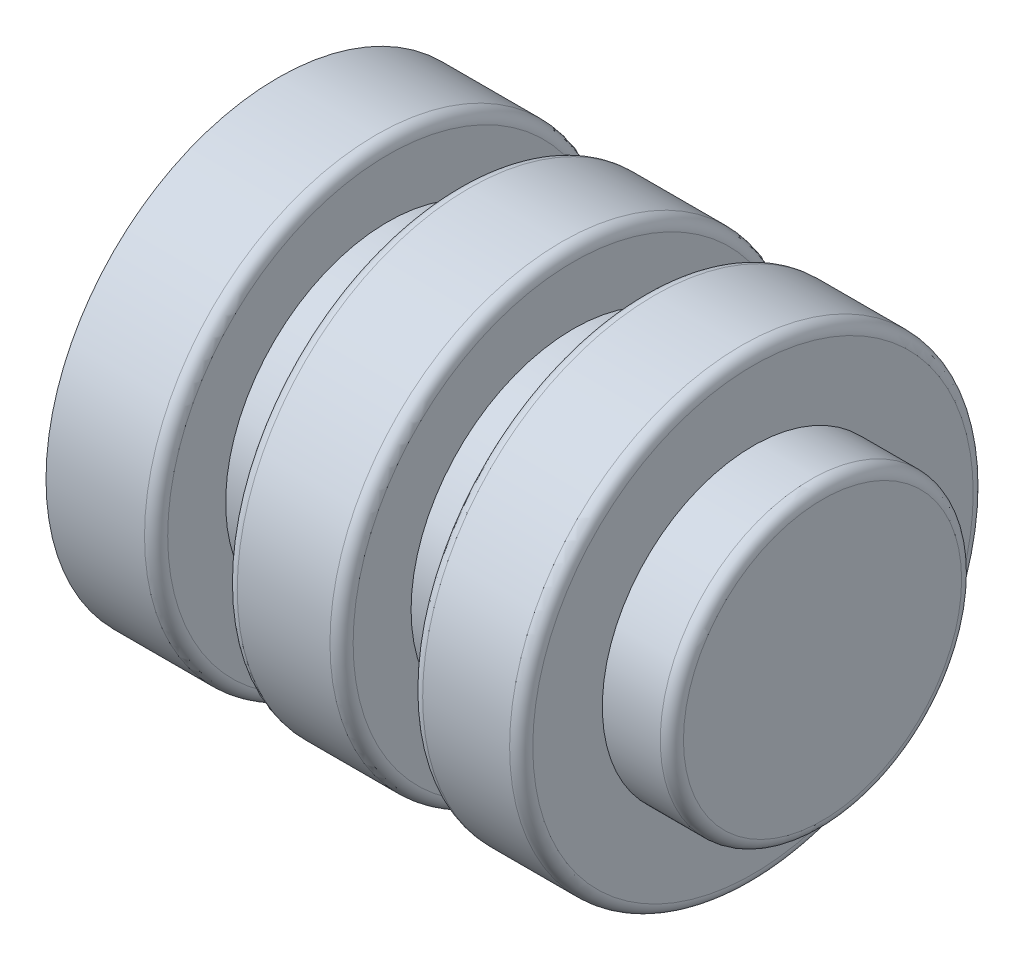
ISO-10303-21;
HEADER;
FILE_DESCRIPTION(('STEP AP214'),'2;1');
FILE_NAME('part.step','',(''),(''),'','','');
FILE_SCHEMA(('AUTOMOTIVE_DESIGN { 1 0 10303 214 1 1 1 1 }'));
ENDSEC;
DATA;
#1=APPLICATION_CONTEXT('core data for automotive mechanical design processes');
#2=APPLICATION_PROTOCOL_DEFINITION('international standard','automotive_design',2000,#1);
#3=PRODUCT_CONTEXT('',#1,'mechanical');
#4=PRODUCT('Part','Part','',(#3));
#5=PRODUCT_RELATED_PRODUCT_CATEGORY('part','',(#4));
#6=PRODUCT_DEFINITION_FORMATION('','',#4);
#7=PRODUCT_DEFINITION_CONTEXT('part definition',#1,'design');
#8=PRODUCT_DEFINITION('design','',#6,#7);
#9=PRODUCT_DEFINITION_SHAPE('','',#8);
#10=(LENGTH_UNIT() NAMED_UNIT(*) SI_UNIT(.MILLI.,.METRE.));
#11=(NAMED_UNIT(*) PLANE_ANGLE_UNIT() SI_UNIT($,.RADIAN.));
#12=(NAMED_UNIT(*) SI_UNIT($,.STERADIAN.) SOLID_ANGLE_UNIT());
#13=UNCERTAINTY_MEASURE_WITH_UNIT(LENGTH_MEASURE(1.E-05),#10,'distance_accuracy_value','');
#14=(GEOMETRIC_REPRESENTATION_CONTEXT(3) GLOBAL_UNCERTAINTY_ASSIGNED_CONTEXT((#13)) GLOBAL_UNIT_ASSIGNED_CONTEXT((#10,
#11,#12)) REPRESENTATION_CONTEXT('',''));
#15=CARTESIAN_POINT('',(0.,0.,0.));
#16=DIRECTION('',(0.,0.,1.));
#17=DIRECTION('',(1.,0.,0.));
#18=AXIS2_PLACEMENT_3D('',#15,#16,#17);
#19=CARTESIAN_POINT('',(-8.,0.,0.));
#20=DIRECTION('',(-1.,0.,0.));
#21=DIRECTION('',(0.,0.,1.));
#22=AXIS2_PLACEMENT_3D('',#19,#20,#21);
#23=PLANE('',#22);
#24=CARTESIAN_POINT('',(-8.,0.,0.));
#25=DIRECTION('',(-1.,0.,0.));
#26=DIRECTION('',(0.,0.,1.));
#27=AXIS2_PLACEMENT_3D('',#24,#25,#26);
#28=CIRCLE('',#27,9.5);
#29=CARTESIAN_POINT('',(-8.,0.,9.5));
#30=VERTEX_POINT('',#29);
#31=EDGE_CURVE('E60',#30,#30,#28,.T.);
#32=ORIENTED_EDGE('',*,*,#31,.T.);
#33=EDGE_LOOP('',(#32));
#34=FACE_BOUND('',#33,.T.);
#35=CARTESIAN_POINT('',(-8.,0.,0.));
#36=DIRECTION('',(-1.,0.,0.));
#37=DIRECTION('',(0.,0.,1.));
#38=AXIS2_PLACEMENT_3D('',#35,#36,#37);
#39=CIRCLE('',#38,7.);
#40=CARTESIAN_POINT('',(-8.,0.,-7.));
#41=VERTEX_POINT('',#40);
#42=EDGE_CURVE('E85',#41,#41,#39,.T.);
#43=ORIENTED_EDGE('',*,*,#42,.F.);
#44=EDGE_LOOP('',(#43));
#45=FACE_BOUND('',#44,.T.);
#46=ADVANCED_FACE('F31',(#34,#45),#23,.T.);
#47=CARTESIAN_POINT('',(0.,0.,0.));
#48=DIRECTION('',(1.,0.,0.));
#49=DIRECTION('',(0.,0.,-1.));
#50=AXIS2_PLACEMENT_3D('',#47,#48,#49);
#51=PLANE('',#50);
#52=CARTESIAN_POINT('',(0.,0.,0.));
#53=DIRECTION('',(1.,0.,0.));
#54=DIRECTION('',(0.,0.,-1.));
#55=AXIS2_PLACEMENT_3D('',#52,#53,#54);
#56=CIRCLE('',#55,9.5);
#57=CARTESIAN_POINT('',(0.,0.,-9.5));
#58=VERTEX_POINT('',#57);
#59=EDGE_CURVE('E38',#58,#58,#56,.F.);
#60=ORIENTED_EDGE('',*,*,#59,.T.);
#61=EDGE_LOOP('',(#60));
#62=FACE_BOUND('',#61,.T.);
#63=CARTESIAN_POINT('',(0.,0.,0.));
#64=DIRECTION('',(1.,0.,0.));
#65=DIRECTION('',(0.,0.,-1.));
#66=AXIS2_PLACEMENT_3D('',#63,#64,#65);
#67=CIRCLE('',#66,7.);
#68=CARTESIAN_POINT('',(0.,0.,-7.));
#69=VERTEX_POINT('',#68);
#70=EDGE_CURVE('E75',#69,#69,#67,.F.);
#71=ORIENTED_EDGE('',*,*,#70,.F.);
#72=EDGE_LOOP('',(#71));
#73=FACE_BOUND('',#72,.T.);
#74=ADVANCED_FACE('F113',(#62,#73),#51,.F.);
#75=CARTESIAN_POINT('',(4.75,0.,0.));
#76=DIRECTION('',(1.,0.,0.));
#77=DIRECTION('',(0.,0.,-1.));
#78=AXIS2_PLACEMENT_3D('',#75,#76,#77);
#79=PLANE('',#78);
#80=CARTESIAN_POINT('',(4.75,0.,0.));
#81=DIRECTION('',(1.,0.,0.));
#82=DIRECTION('',(0.,0.,-1.));
#83=AXIS2_PLACEMENT_3D('',#80,#81,#82);
#84=CIRCLE('',#83,9.5);
#85=CARTESIAN_POINT('',(4.75,0.,-9.5));
#86=VERTEX_POINT('',#85);
#87=EDGE_CURVE('E10',#86,#86,#84,.T.);
#88=ORIENTED_EDGE('',*,*,#87,.T.);
#89=EDGE_LOOP('',(#88));
#90=FACE_BOUND('',#89,.T.);
#91=CARTESIAN_POINT('',(4.75,0.,0.));
#92=DIRECTION('',(1.,0.,0.));
#93=DIRECTION('',(0.,0.,-1.));
#94=AXIS2_PLACEMENT_3D('',#91,#92,#93);
#95=CIRCLE('',#94,6.5);
#96=CARTESIAN_POINT('',(4.75,0.,-6.5));
#97=VERTEX_POINT('',#96);
#98=EDGE_CURVE('E78',#97,#97,#95,.T.);
#99=ORIENTED_EDGE('',*,*,#98,.F.);
#100=EDGE_LOOP('',(#99));
#101=FACE_BOUND('',#100,.T.);
#102=ADVANCED_FACE('F120',(#90,#101),#79,.T.);
#103=CARTESIAN_POINT('',(4.75,0.,0.));
#104=DIRECTION('',(-1.,0.,0.));
#105=DIRECTION('',(0.,0.,1.));
#106=AXIS2_PLACEMENT_3D('',#103,#104,#105);
#107=CYLINDRICAL_SURFACE('',#106,10.);
#108=CARTESIAN_POINT('',(0.5,0.,0.));
#109=DIRECTION('',(1.,0.,0.));
#110=DIRECTION('',(0.,0.,-1.));
#111=AXIS2_PLACEMENT_3D('',#108,#109,#110);
#112=CIRCLE('',#111,10.);
#113=CARTESIAN_POINT('',(0.5,0.,-10.));
#114=VERTEX_POINT('',#113);
#115=EDGE_CURVE('E42',#114,#114,#112,.T.);
#116=ORIENTED_EDGE('',*,*,#115,.T.);
#117=EDGE_LOOP('',(#116));
#118=FACE_BOUND('',#117,.T.);
#119=CARTESIAN_POINT('',(4.25,0.,0.));
#120=DIRECTION('',(1.,0.,0.));
#121=DIRECTION('',(0.,0.,-1.));
#122=AXIS2_PLACEMENT_3D('',#119,#120,#121);
#123=CIRCLE('',#122,10.);
#124=CARTESIAN_POINT('',(4.25,0.,-10.));
#125=VERTEX_POINT('',#124);
#126=EDGE_CURVE('E46',#125,#125,#123,.F.);
#127=ORIENTED_EDGE('',*,*,#126,.T.);
#128=EDGE_LOOP('',(#127));
#129=FACE_BOUND('',#128,.T.);
#130=ADVANCED_FACE('F144',(#118,#129),#107,.T.);
#131=CARTESIAN_POINT('',(7.75,0.,0.));
#132=DIRECTION('',(-1.,0.,0.));
#133=DIRECTION('',(0.,0.,1.));
#134=AXIS2_PLACEMENT_3D('',#131,#132,#133);
#135=CYLINDRICAL_SURFACE('',#134,6.5);
#136=CARTESIAN_POINT('',(7.25,0.,0.));
#137=DIRECTION('',(1.,0.,0.));
#138=DIRECTION('',(0.,0.,-1.));
#139=AXIS2_PLACEMENT_3D('',#136,#137,#138);
#140=CIRCLE('',#139,6.5);
#141=CARTESIAN_POINT('',(7.25,0.,-6.5));
#142=VERTEX_POINT('',#141);
#143=EDGE_CURVE('E69',#142,#142,#140,.F.);
#144=ORIENTED_EDGE('',*,*,#143,.T.);
#145=EDGE_LOOP('',(#144));
#146=FACE_BOUND('',#145,.T.);
#147=ORIENTED_EDGE('',*,*,#98,.T.);
#148=EDGE_LOOP('',(#147));
#149=FACE_BOUND('',#148,.T.);
#150=ADVANCED_FACE('F140',(#146,#149),#135,.T.);
#151=CARTESIAN_POINT('',(7.75,0.,0.));
#152=DIRECTION('',(1.,0.,0.));
#153=DIRECTION('',(0.,0.,-1.));
#154=AXIS2_PLACEMENT_3D('',#151,#152,#153);
#155=PLANE('',#154);
#156=CARTESIAN_POINT('',(7.75,0.,0.));
#157=DIRECTION('',(1.,0.,0.));
#158=DIRECTION('',(0.,0.,-1.));
#159=AXIS2_PLACEMENT_3D('',#156,#157,#158);
#160=CIRCLE('',#159,6.);
#161=CARTESIAN_POINT('',(7.75,0.,-6.));
#162=VERTEX_POINT('',#161);
#163=EDGE_CURVE('E72',#162,#162,#160,.T.);
#164=ORIENTED_EDGE('',*,*,#163,.T.);
#165=EDGE_LOOP('',(#164));
#166=FACE_BOUND('',#165,.T.);
#167=ADVANCED_FACE('F136',(#166),#155,.T.);
#168=CARTESIAN_POINT('',(-3.,0.,0.));
#169=DIRECTION('',(1.,0.,0.));
#170=DIRECTION('',(0.,0.,-1.));
#171=AXIS2_PLACEMENT_3D('',#168,#169,#170);
#172=CYLINDRICAL_SURFACE('',#171,7.);
#173=CARTESIAN_POINT('',(-3.,0.,0.));
#174=DIRECTION('',(-1.,0.,0.));
#175=DIRECTION('',(0.,0.,1.));
#176=AXIS2_PLACEMENT_3D('',#173,#174,#175);
#177=CIRCLE('',#176,7.);
#178=CARTESIAN_POINT('',(-3.,0.,7.));
#179=VERTEX_POINT('',#178);
#180=EDGE_CURVE('E81',#179,#179,#177,.T.);
#181=ORIENTED_EDGE('',*,*,#180,.F.);
#182=EDGE_LOOP('',(#181));
#183=FACE_BOUND('',#182,.T.);
#184=ORIENTED_EDGE('',*,*,#70,.T.);
#185=EDGE_LOOP('',(#184));
#186=FACE_BOUND('',#185,.T.);
#187=ADVANCED_FACE('F133',(#183,#186),#172,.T.);
#188=CARTESIAN_POINT('',(7.25,0.,0.));
#189=DIRECTION('',(1.,0.,0.));
#190=DIRECTION('',(0.,0.,-1.));
#191=AXIS2_PLACEMENT_3D('',#188,#189,#190);
#192=TOROIDAL_SURFACE('',#191,6.,0.5);
#193=ORIENTED_EDGE('',*,*,#143,.F.);
#194=EDGE_LOOP('',(#193));
#195=FACE_BOUND('',#194,.T.);
#196=ORIENTED_EDGE('',*,*,#163,.F.);
#197=EDGE_LOOP('',(#196));
#198=FACE_BOUND('',#197,.T.);
#199=ADVANCED_FACE('F128',(#195,#198),#192,.T.);
#200=CARTESIAN_POINT('',(-3.,0.,0.));
#201=DIRECTION('',(-1.,0.,0.));
#202=DIRECTION('',(0.,0.,1.));
#203=AXIS2_PLACEMENT_3D('',#200,#201,#202);
#204=PLANE('',#203);
#205=CARTESIAN_POINT('',(-3.,0.,0.));
#206=DIRECTION('',(-1.,0.,0.));
#207=DIRECTION('',(0.,0.,1.));
#208=AXIS2_PLACEMENT_3D('',#205,#206,#207);
#209=CIRCLE('',#208,9.5);
#210=CARTESIAN_POINT('',(-3.,0.,9.5));
#211=VERTEX_POINT('',#210);
#212=EDGE_CURVE('E51',#211,#211,#209,.F.);
#213=ORIENTED_EDGE('',*,*,#212,.T.);
#214=EDGE_LOOP('',(#213));
#215=FACE_BOUND('',#214,.T.);
#216=ORIENTED_EDGE('',*,*,#180,.T.);
#217=EDGE_LOOP('',(#216));
#218=FACE_BOUND('',#217,.T.);
#219=ADVANCED_FACE('F124',(#215,#218),#204,.F.);
#220=CARTESIAN_POINT('',(-8.,0.,0.));
#221=DIRECTION('',(1.,0.,0.));
#222=DIRECTION('',(0.,0.,-1.));
#223=AXIS2_PLACEMENT_3D('',#220,#221,#222);
#224=CYLINDRICAL_SURFACE('',#223,10.);
#225=CARTESIAN_POINT('',(-7.5,0.,0.));
#226=DIRECTION('',(-1.,0.,0.));
#227=DIRECTION('',(0.,0.,1.));
#228=AXIS2_PLACEMENT_3D('',#225,#226,#227);
#229=CIRCLE('',#228,10.);
#230=CARTESIAN_POINT('',(-7.5,0.,10.));
#231=VERTEX_POINT('',#230);
#232=EDGE_CURVE('E54',#231,#231,#229,.F.);
#233=ORIENTED_EDGE('',*,*,#232,.T.);
#234=EDGE_LOOP('',(#233));
#235=FACE_BOUND('',#234,.T.);
#236=CARTESIAN_POINT('',(-3.5,0.,0.));
#237=DIRECTION('',(-1.,0.,0.));
#238=DIRECTION('',(0.,0.,1.));
#239=AXIS2_PLACEMENT_3D('',#236,#237,#238);
#240=CIRCLE('',#239,10.);
#241=CARTESIAN_POINT('',(-3.5,0.,10.));
#242=VERTEX_POINT('',#241);
#243=EDGE_CURVE('E57',#242,#242,#240,.T.);
#244=ORIENTED_EDGE('',*,*,#243,.T.);
#245=EDGE_LOOP('',(#244));
#246=FACE_BOUND('',#245,.T.);
#247=ADVANCED_FACE('F127',(#235,#246),#224,.T.);
#248=CARTESIAN_POINT('',(-11.,0.,0.));
#249=DIRECTION('',(1.,0.,0.));
#250=DIRECTION('',(0.,0.,-1.));
#251=AXIS2_PLACEMENT_3D('',#248,#249,#250);
#252=CYLINDRICAL_SURFACE('',#251,7.);
#253=CARTESIAN_POINT('',(-11.,0.,0.));
#254=DIRECTION('',(-1.,0.,0.));
#255=DIRECTION('',(0.,0.,1.));
#256=AXIS2_PLACEMENT_3D('',#253,#254,#255);
#257=CIRCLE('',#256,7.);
#258=CARTESIAN_POINT('',(-11.,0.,-7.));
#259=VERTEX_POINT('',#258);
#260=EDGE_CURVE('E84',#259,#259,#257,.T.);
#261=CARTESIAN_POINT('',(-11.,0.,-7.));
#262=CARTESIAN_POINT('',(-10.96875,0.,-7.));
#263=CARTESIAN_POINT('',(-10.9375,0.,-7.));
#264=CARTESIAN_POINT('',(-10.875,0.,-7.));
#265=CARTESIAN_POINT('',(-10.84375,0.,-7.));
#266=CARTESIAN_POINT('',(-10.78125,0.,-7.));
#267=CARTESIAN_POINT('',(-10.75,0.,-7.));
#268=CARTESIAN_POINT('',(-10.6875,0.,-7.));
#269=CARTESIAN_POINT('',(-10.65625,0.,-7.));
#270=CARTESIAN_POINT('',(-10.59375,0.,-7.));
#271=CARTESIAN_POINT('',(-10.5625,0.,-7.));
#272=CARTESIAN_POINT('',(-10.5,0.,-7.));
#273=CARTESIAN_POINT('',(-10.46875,0.,-7.));
#274=CARTESIAN_POINT('',(-10.40625,0.,-7.));
#275=CARTESIAN_POINT('',(-10.375,0.,-7.));
#276=CARTESIAN_POINT('',(-10.3125,0.,-7.));
#277=CARTESIAN_POINT('',(-10.28125,0.,-7.));
#278=CARTESIAN_POINT('',(-10.21875,0.,-7.));
#279=CARTESIAN_POINT('',(-10.1875,0.,-7.));
#280=CARTESIAN_POINT('',(-10.125,0.,-7.));
#281=CARTESIAN_POINT('',(-10.09375,0.,-7.));
#282=CARTESIAN_POINT('',(-10.03125,0.,-7.));
#283=CARTESIAN_POINT('',(-10.,0.,-7.));
#284=CARTESIAN_POINT('',(-9.9375,0.,-7.));
#285=CARTESIAN_POINT('',(-9.90625,0.,-7.));
#286=CARTESIAN_POINT('',(-9.84375,0.,-7.));
#287=CARTESIAN_POINT('',(-9.8125,0.,-7.));
#288=CARTESIAN_POINT('',(-9.75,0.,-7.));
#289=CARTESIAN_POINT('',(-9.71875,0.,-7.));
#290=CARTESIAN_POINT('',(-9.65625,0.,-7.));
#291=CARTESIAN_POINT('',(-9.625,0.,-7.));
#292=CARTESIAN_POINT('',(-9.5625,0.,-7.));
#293=CARTESIAN_POINT('',(-9.53125,0.,-7.));
#294=CARTESIAN_POINT('',(-9.46875,0.,-7.));
#295=CARTESIAN_POINT('',(-9.4375,0.,-7.));
#296=CARTESIAN_POINT('',(-9.375,0.,-7.));
#297=CARTESIAN_POINT('',(-9.34375,0.,-7.));
#298=CARTESIAN_POINT('',(-9.28125,0.,-7.));
#299=CARTESIAN_POINT('',(-9.25,0.,-7.));
#300=CARTESIAN_POINT('',(-9.1875,0.,-7.));
#301=CARTESIAN_POINT('',(-9.15625,0.,-7.));
#302=CARTESIAN_POINT('',(-9.09375,0.,-7.));
#303=CARTESIAN_POINT('',(-9.0625,0.,-7.));
#304=CARTESIAN_POINT('',(-9.,0.,-7.));
#305=CARTESIAN_POINT('',(-8.96875,0.,-7.));
#306=CARTESIAN_POINT('',(-8.90625,0.,-7.));
#307=CARTESIAN_POINT('',(-8.875,0.,-7.));
#308=CARTESIAN_POINT('',(-8.8125,0.,-7.));
#309=CARTESIAN_POINT('',(-8.78125,0.,-7.));
#310=CARTESIAN_POINT('',(-8.71875,0.,-7.));
#311=CARTESIAN_POINT('',(-8.6875,0.,-7.));
#312=CARTESIAN_POINT('',(-8.625,0.,-7.));
#313=CARTESIAN_POINT('',(-8.59375,0.,-7.));
#314=CARTESIAN_POINT('',(-8.53125,0.,-7.));
#315=CARTESIAN_POINT('',(-8.5,0.,-7.));
#316=CARTESIAN_POINT('',(-8.4375,0.,-7.));
#317=CARTESIAN_POINT('',(-8.40625,0.,-7.));
#318=CARTESIAN_POINT('',(-8.34375,0.,-7.));
#319=CARTESIAN_POINT('',(-8.3125,0.,-7.));
#320=CARTESIAN_POINT('',(-8.25,0.,-7.));
#321=CARTESIAN_POINT('',(-8.21875,0.,-7.));
#322=CARTESIAN_POINT('',(-8.15625,0.,-7.));
#323=CARTESIAN_POINT('',(-8.125,0.,-7.));
#324=CARTESIAN_POINT('',(-8.0625,0.,-7.));
#325=CARTESIAN_POINT('',(-8.03125,0.,-7.));
#326=CARTESIAN_POINT('',(-8.,0.,-7.));
#327=B_SPLINE_CURVE_WITH_KNOTS('',3,(#261,#262,#263,#264,#265,#266,#267,#268,#269,#270,#271,
#272,#273,#274,#275,#276,#277,#278,#279,#280,#281,#282,#283,#284,#285,#286,#287,#288,#289,#290,
#291,#292,#293,#294,#295,#296,#297,#298,#299,#300,#301,#302,#303,#304,#305,#306,#307,#308,#309,
#310,#311,#312,#313,#314,#315,#316,#317,#318,#319,#320,#321,#322,#323,#324,#325,#326),
.UNSPECIFIED.,.F.,.F.,(4,2,2,2,2,2,2,2,2,2,2,2,2,2,2,2,2,2,2,2,2,2,2,2,2,2,2,2,2,2,2,2,4),(0.,
0.0937500000000018,0.187500000000002,0.281250000000002,0.375000000000002,0.468750000000002,
0.562500000000002,0.656250000000002,0.750000000000002,0.843750000000002,0.937500000000003,
1.03125,1.125,1.21875,1.3125,1.40625,1.5,1.59375,1.6875,1.78125,1.875,1.96875,2.0625,2.15625,
2.25,2.34375,2.4375,2.53125,2.625,2.71875,2.8125,2.90625,3.),.UNSPECIFIED.);
#328=EDGE_CURVE('BSEAM108',#259,#41,#327,.T.);
#329=ORIENTED_EDGE('',*,*,#260,.F.);
#330=ORIENTED_EDGE('',*,*,#42,.T.);
#331=ORIENTED_EDGE('',*,*,#328,.T.);
#332=ORIENTED_EDGE('',*,*,#328,.F.);
#333=EDGE_LOOP('',(#329,#331,#330,#332));
#334=FACE_BOUND('',#333,.T.);
#335=ADVANCED_FACE('F108',(#334),#252,.T.);
#336=CARTESIAN_POINT('',(-11.,0.,0.));
#337=DIRECTION('',(-1.,0.,0.));
#338=DIRECTION('',(0.,0.,1.));
#339=AXIS2_PLACEMENT_3D('',#336,#337,#338);
#340=PLANE('',#339);
#341=CARTESIAN_POINT('',(-11.,0.,0.));
#342=DIRECTION('',(-1.,0.,0.));
#343=DIRECTION('',(0.,0.,1.));
#344=AXIS2_PLACEMENT_3D('',#341,#342,#343);
#345=CIRCLE('',#344,9.5);
#346=CARTESIAN_POINT('',(-11.,0.,9.5));
#347=VERTEX_POINT('',#346);
#348=EDGE_CURVE('E63',#347,#347,#345,.F.);
#349=ORIENTED_EDGE('',*,*,#348,.T.);
#350=EDGE_LOOP('',(#349));
#351=FACE_BOUND('',#350,.T.);
#352=ORIENTED_EDGE('',*,*,#260,.T.);
#353=EDGE_LOOP('',(#352));
#354=FACE_BOUND('',#353,.T.);
#355=ADVANCED_FACE('F98',(#351,#354),#340,.F.);
#356=CARTESIAN_POINT('',(-15.75,0.,0.));
#357=DIRECTION('',(1.,0.,0.));
#358=DIRECTION('',(0.,0.,-1.));
#359=AXIS2_PLACEMENT_3D('',#356,#357,#358);
#360=CYLINDRICAL_SURFACE('',#359,10.);
#361=CARTESIAN_POINT('',(-11.5,0.,0.));
#362=DIRECTION('',(-1.,0.,0.));
#363=DIRECTION('',(0.,0.,1.));
#364=AXIS2_PLACEMENT_3D('',#361,#362,#363);
#365=CIRCLE('',#364,10.);
#366=CARTESIAN_POINT('',(-11.5,0.,10.));
#367=VERTEX_POINT('',#366);
#368=EDGE_CURVE('E66',#367,#367,#365,.T.);
#369=ORIENTED_EDGE('',*,*,#368,.T.);
#370=EDGE_LOOP('',(#369));
#371=FACE_BOUND('',#370,.T.);
#372=CARTESIAN_POINT('',(-15.75,0.,0.));
#373=DIRECTION('',(-1.,0.,0.));
#374=DIRECTION('',(0.,0.,1.));
#375=AXIS2_PLACEMENT_3D('',#372,#373,#374);
#376=CIRCLE('',#375,10.);
#377=CARTESIAN_POINT('',(-15.75,0.,10.));
#378=VERTEX_POINT('',#377);
#379=EDGE_CURVE('E88',#378,#378,#376,.T.);
#380=ORIENTED_EDGE('',*,*,#379,.F.);
#381=EDGE_LOOP('',(#380));
#382=FACE_BOUND('',#381,.T.);
#383=ADVANCED_FACE('F96',(#371,#382),#360,.T.);
#384=CARTESIAN_POINT('',(-15.75,0.,0.));
#385=DIRECTION('',(-1.,0.,0.));
#386=DIRECTION('',(0.,0.,1.));
#387=AXIS2_PLACEMENT_3D('',#384,#385,#386);
#388=PLANE('',#387);
#389=ORIENTED_EDGE('',*,*,#379,.T.);
#390=EDGE_LOOP('',(#389));
#391=FACE_BOUND('',#390,.T.);
#392=ADVANCED_FACE('F94',(#391),#388,.T.);
#393=CARTESIAN_POINT('',(-11.5,0.,0.));
#394=DIRECTION('',(-1.,0.,0.));
#395=DIRECTION('',(0.,0.,1.));
#396=AXIS2_PLACEMENT_3D('',#393,#394,#395);
#397=TOROIDAL_SURFACE('',#396,9.5,0.5);
#398=ORIENTED_EDGE('',*,*,#348,.F.);
#399=EDGE_LOOP('',(#398));
#400=FACE_BOUND('',#399,.T.);
#401=ORIENTED_EDGE('',*,*,#368,.F.);
#402=EDGE_LOOP('',(#401));
#403=FACE_BOUND('',#402,.T.);
#404=ADVANCED_FACE('F106',(#400,#403),#397,.T.);
#405=CARTESIAN_POINT('',(-7.5,0.,0.));
#406=DIRECTION('',(-1.,0.,0.));
#407=DIRECTION('',(0.,0.,1.));
#408=AXIS2_PLACEMENT_3D('',#405,#406,#407);
#409=TOROIDAL_SURFACE('',#408,9.5,0.5);
#410=ORIENTED_EDGE('',*,*,#232,.F.);
#411=EDGE_LOOP('',(#410));
#412=FACE_BOUND('',#411,.T.);
#413=ORIENTED_EDGE('',*,*,#31,.F.);
#414=EDGE_LOOP('',(#413));
#415=FACE_BOUND('',#414,.T.);
#416=ADVANCED_FACE('F156',(#412,#415),#409,.T.);
#417=CARTESIAN_POINT('',(-3.5,0.,0.));
#418=DIRECTION('',(-1.,0.,0.));
#419=DIRECTION('',(0.,0.,1.));
#420=AXIS2_PLACEMENT_3D('',#417,#418,#419);
#421=TOROIDAL_SURFACE('',#420,9.5,0.5);
#422=ORIENTED_EDGE('',*,*,#212,.F.);
#423=EDGE_LOOP('',(#422));
#424=FACE_BOUND('',#423,.T.);
#425=ORIENTED_EDGE('',*,*,#243,.F.);
#426=EDGE_LOOP('',(#425));
#427=FACE_BOUND('',#426,.T.);
#428=ADVANCED_FACE('F160',(#424,#427),#421,.T.);
#429=CARTESIAN_POINT('',(0.5,0.,0.));
#430=DIRECTION('',(1.,0.,0.));
#431=DIRECTION('',(0.,0.,-1.));
#432=AXIS2_PLACEMENT_3D('',#429,#430,#431);
#433=TOROIDAL_SURFACE('',#432,9.5,0.5);
#434=ORIENTED_EDGE('',*,*,#59,.F.);
#435=EDGE_LOOP('',(#434));
#436=FACE_BOUND('',#435,.T.);
#437=ORIENTED_EDGE('',*,*,#115,.F.);
#438=EDGE_LOOP('',(#437));
#439=FACE_BOUND('',#438,.T.);
#440=ADVANCED_FACE('F163',(#436,#439),#433,.T.);
#441=CARTESIAN_POINT('',(4.25,0.,0.));
#442=DIRECTION('',(1.,0.,0.));
#443=DIRECTION('',(0.,0.,-1.));
#444=AXIS2_PLACEMENT_3D('',#441,#442,#443);
#445=TOROIDAL_SURFACE('',#444,9.5,0.5);
#446=ORIENTED_EDGE('',*,*,#126,.F.);
#447=EDGE_LOOP('',(#446));
#448=FACE_BOUND('',#447,.T.);
#449=ORIENTED_EDGE('',*,*,#87,.F.);
#450=EDGE_LOOP('',(#449));
#451=FACE_BOUND('',#450,.T.);
#452=ADVANCED_FACE('F33',(#448,#451),#445,.T.);
#453=CLOSED_SHELL('',(#46,#74,#102,#130,#150,#167,#187,#199,#219,#247,#335,#355,#383,#392,#404,
#416,#428,#440,#452));
#454=MANIFOLD_SOLID_BREP('B2',#453);
#455=ADVANCED_BREP_SHAPE_REPRESENTATION('',(#18,#454),#14);
#456=SHAPE_DEFINITION_REPRESENTATION(#9,#455);
ENDSEC;
END-ISO-10303-21;
